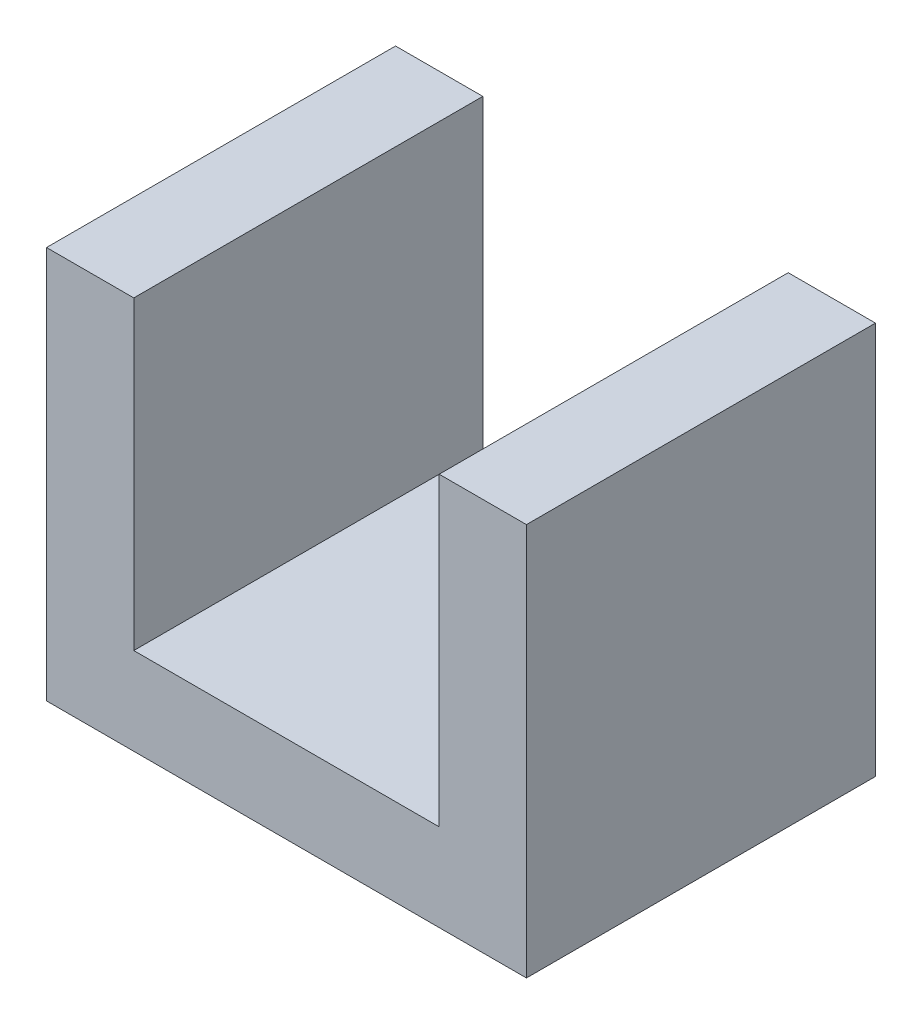
ISO-10303-21;
HEADER;
FILE_DESCRIPTION(('STEP AP214'),'2;1');
FILE_NAME('part.step','',(''),(''),'','','');
FILE_SCHEMA(('AUTOMOTIVE_DESIGN { 1 0 10303 214 1 1 1 1 }'));
ENDSEC;
DATA;
#1=APPLICATION_CONTEXT('core data for automotive mechanical design processes');
#2=APPLICATION_PROTOCOL_DEFINITION('international standard','automotive_design',2000,#1);
#3=PRODUCT_CONTEXT('',#1,'mechanical');
#4=PRODUCT('Part','Part','',(#3));
#5=PRODUCT_RELATED_PRODUCT_CATEGORY('part','',(#4));
#6=PRODUCT_DEFINITION_FORMATION('','',#4);
#7=PRODUCT_DEFINITION_CONTEXT('part definition',#1,'design');
#8=PRODUCT_DEFINITION('design','',#6,#7);
#9=PRODUCT_DEFINITION_SHAPE('','',#8);
#10=(LENGTH_UNIT() NAMED_UNIT(*) SI_UNIT(.MILLI.,.METRE.));
#11=(NAMED_UNIT(*) PLANE_ANGLE_UNIT() SI_UNIT($,.RADIAN.));
#12=(NAMED_UNIT(*) SI_UNIT($,.STERADIAN.) SOLID_ANGLE_UNIT());
#13=UNCERTAINTY_MEASURE_WITH_UNIT(LENGTH_MEASURE(1.E-05),#10,'distance_accuracy_value','');
#14=(GEOMETRIC_REPRESENTATION_CONTEXT(3) GLOBAL_UNCERTAINTY_ASSIGNED_CONTEXT((#13)) GLOBAL_UNIT_ASSIGNED_CONTEXT((#10,
#11,#12)) REPRESENTATION_CONTEXT('',''));
#15=CARTESIAN_POINT('',(0.,0.,0.));
#16=DIRECTION('',(0.,0.,1.));
#17=DIRECTION('',(1.,0.,0.));
#18=AXIS2_PLACEMENT_3D('',#15,#16,#17);
#19=CARTESIAN_POINT('',(-2.,7.,8.));
#20=DIRECTION('',(0.,-1.,0.));
#21=DIRECTION('',(0.,0.,-1.));
#22=AXIS2_PLACEMENT_3D('',#19,#20,#21);
#23=PLANE('',#22);
#24=DIRECTION('',(-1.,0.,0.));
#25=VECTOR('',#24,1.);
#26=CARTESIAN_POINT('',(-2.,7.,0.));
#27=LINE('',#26,#25);
#28=CARTESIAN_POINT('',(0.,7.,0.));
#29=VERTEX_POINT('',#28);
#30=CARTESIAN_POINT('',(-2.,7.,0.));
#31=VERTEX_POINT('',#30);
#32=EDGE_CURVE('E140',#29,#31,#27,.T.);
#33=ORIENTED_EDGE('',*,*,#32,.T.);
#34=DIRECTION('',(0.,0.,-1.));
#35=VECTOR('',#34,1.);
#36=CARTESIAN_POINT('',(-2.,7.,8.));
#37=LINE('',#36,#35);
#38=CARTESIAN_POINT('',(-2.,7.,8.));
#39=VERTEX_POINT('',#38);
#40=EDGE_CURVE('E11',#39,#31,#37,.T.);
#41=ORIENTED_EDGE('',*,*,#40,.F.);
#42=DIRECTION('',(-1.,0.,0.));
#43=VECTOR('',#42,1.);
#44=CARTESIAN_POINT('',(-2.,7.,8.));
#45=LINE('',#44,#43);
#46=CARTESIAN_POINT('',(0.,7.,8.));
#47=VERTEX_POINT('',#46);
#48=EDGE_CURVE('E162',#47,#39,#45,.T.);
#49=ORIENTED_EDGE('',*,*,#48,.F.);
#50=DIRECTION('',(0.,0.,-1.));
#51=VECTOR('',#50,1.);
#52=CARTESIAN_POINT('',(0.,7.,8.));
#53=LINE('',#52,#51);
#54=EDGE_CURVE('E136',#47,#29,#53,.T.);
#55=ORIENTED_EDGE('',*,*,#54,.T.);
#56=EDGE_LOOP('',(#33,#41,#49,#55));
#57=FACE_BOUND('',#56,.T.);
#58=ADVANCED_FACE('F39',(#57),#23,.F.);
#59=CARTESIAN_POINT('',(-2.,-2.,8.));
#60=DIRECTION('',(1.,0.,0.));
#61=DIRECTION('',(0.,0.,-1.));
#62=AXIS2_PLACEMENT_3D('',#59,#60,#61);
#63=PLANE('',#62);
#64=DIRECTION('',(0.,-1.,0.));
#65=VECTOR('',#64,1.);
#66=CARTESIAN_POINT('',(-2.,-2.,0.));
#67=LINE('',#66,#65);
#68=CARTESIAN_POINT('',(-2.,-2.,0.));
#69=VERTEX_POINT('',#68);
#70=EDGE_CURVE('E144',#31,#69,#67,.T.);
#71=ORIENTED_EDGE('',*,*,#70,.T.);
#72=DIRECTION('',(0.,0.,-1.));
#73=VECTOR('',#72,1.);
#74=CARTESIAN_POINT('',(-2.,-2.,8.));
#75=LINE('',#74,#73);
#76=CARTESIAN_POINT('',(-2.,-2.,8.));
#77=VERTEX_POINT('',#76);
#78=EDGE_CURVE('E48',#77,#69,#75,.T.);
#79=ORIENTED_EDGE('',*,*,#78,.F.);
#80=DIRECTION('',(0.,-1.,0.));
#81=VECTOR('',#80,1.);
#82=CARTESIAN_POINT('',(-2.,-2.,8.));
#83=LINE('',#82,#81);
#84=EDGE_CURVE('E99',#39,#77,#83,.T.);
#85=ORIENTED_EDGE('',*,*,#84,.F.);
#86=ORIENTED_EDGE('',*,*,#40,.T.);
#87=EDGE_LOOP('',(#71,#79,#85,#86));
#88=FACE_BOUND('',#87,.T.);
#89=ADVANCED_FACE('F208',(#88),#63,.F.);
#90=CARTESIAN_POINT('',(9.,-2.,8.));
#91=DIRECTION('',(0.,1.,0.));
#92=DIRECTION('',(-1.,0.,0.));
#93=AXIS2_PLACEMENT_3D('',#90,#91,#92);
#94=PLANE('',#93);
#95=DIRECTION('',(1.,0.,0.));
#96=VECTOR('',#95,1.);
#97=CARTESIAN_POINT('',(9.,-2.,0.));
#98=LINE('',#97,#96);
#99=CARTESIAN_POINT('',(9.,-2.,0.));
#100=VERTEX_POINT('',#99);
#101=EDGE_CURVE('E147',#69,#100,#98,.T.);
#102=ORIENTED_EDGE('',*,*,#101,.T.);
#103=DIRECTION('',(0.,0.,-1.));
#104=VECTOR('',#103,1.);
#105=CARTESIAN_POINT('',(9.,-2.,8.));
#106=LINE('',#105,#104);
#107=CARTESIAN_POINT('',(9.,-2.,8.));
#108=VERTEX_POINT('',#107);
#109=EDGE_CURVE('E173',#108,#100,#106,.T.);
#110=ORIENTED_EDGE('',*,*,#109,.F.);
#111=DIRECTION('',(1.,0.,0.));
#112=VECTOR('',#111,1.);
#113=CARTESIAN_POINT('',(9.,-2.,8.));
#114=LINE('',#113,#112);
#115=EDGE_CURVE('E183',#77,#108,#114,.T.);
#116=ORIENTED_EDGE('',*,*,#115,.F.);
#117=ORIENTED_EDGE('',*,*,#78,.T.);
#118=EDGE_LOOP('',(#102,#110,#116,#117));
#119=FACE_BOUND('',#118,.T.);
#120=ADVANCED_FACE('F181',(#119),#94,.F.);
#121=CARTESIAN_POINT('',(9.,7.,8.));
#122=DIRECTION('',(-1.,0.,0.));
#123=DIRECTION('',(0.,-1.,0.));
#124=AXIS2_PLACEMENT_3D('',#121,#122,#123);
#125=PLANE('',#124);
#126=DIRECTION('',(0.,1.,0.));
#127=VECTOR('',#126,1.);
#128=CARTESIAN_POINT('',(9.,7.,0.));
#129=LINE('',#128,#127);
#130=CARTESIAN_POINT('',(9.,7.,0.));
#131=VERTEX_POINT('',#130);
#132=EDGE_CURVE('E150',#100,#131,#129,.T.);
#133=ORIENTED_EDGE('',*,*,#132,.T.);
#134=DIRECTION('',(0.,0.,-1.));
#135=VECTOR('',#134,1.);
#136=CARTESIAN_POINT('',(9.,7.,8.));
#137=LINE('',#136,#135);
#138=CARTESIAN_POINT('',(9.,7.,8.));
#139=VERTEX_POINT('',#138);
#140=EDGE_CURVE('E169',#139,#131,#137,.T.);
#141=ORIENTED_EDGE('',*,*,#140,.F.);
#142=DIRECTION('',(0.,1.,0.));
#143=VECTOR('',#142,1.);
#144=CARTESIAN_POINT('',(9.,7.,8.));
#145=LINE('',#144,#143);
#146=EDGE_CURVE('E196',#108,#139,#145,.T.);
#147=ORIENTED_EDGE('',*,*,#146,.F.);
#148=ORIENTED_EDGE('',*,*,#109,.T.);
#149=EDGE_LOOP('',(#133,#141,#147,#148));
#150=FACE_BOUND('',#149,.T.);
#151=ADVANCED_FACE('F191',(#150),#125,.F.);
#152=CARTESIAN_POINT('',(7.,7.,8.));
#153=DIRECTION('',(0.,-1.,0.));
#154=DIRECTION('',(0.,0.,-1.));
#155=AXIS2_PLACEMENT_3D('',#152,#153,#154);
#156=PLANE('',#155);
#157=DIRECTION('',(-1.,0.,0.));
#158=VECTOR('',#157,1.);
#159=CARTESIAN_POINT('',(7.,7.,0.));
#160=LINE('',#159,#158);
#161=CARTESIAN_POINT('',(7.,7.,0.));
#162=VERTEX_POINT('',#161);
#163=EDGE_CURVE('E153',#131,#162,#160,.T.);
#164=ORIENTED_EDGE('',*,*,#163,.T.);
#165=DIRECTION('',(0.,0.,-1.));
#166=VECTOR('',#165,1.);
#167=CARTESIAN_POINT('',(7.,7.,8.));
#168=LINE('',#167,#166);
#169=CARTESIAN_POINT('',(7.,7.,8.));
#170=VERTEX_POINT('',#169);
#171=EDGE_CURVE('E129',#170,#162,#168,.T.);
#172=ORIENTED_EDGE('',*,*,#171,.F.);
#173=DIRECTION('',(-1.,0.,0.));
#174=VECTOR('',#173,1.);
#175=CARTESIAN_POINT('',(7.,7.,8.));
#176=LINE('',#175,#174);
#177=EDGE_CURVE('E118',#139,#170,#176,.T.);
#178=ORIENTED_EDGE('',*,*,#177,.F.);
#179=ORIENTED_EDGE('',*,*,#140,.T.);
#180=EDGE_LOOP('',(#164,#172,#178,#179));
#181=FACE_BOUND('',#180,.T.);
#182=ADVANCED_FACE('F194',(#181),#156,.F.);
#183=CARTESIAN_POINT('',(7.,0.,8.));
#184=DIRECTION('',(1.,0.,0.));
#185=DIRECTION('',(0.,0.,-1.));
#186=AXIS2_PLACEMENT_3D('',#183,#184,#185);
#187=PLANE('',#186);
#188=DIRECTION('',(0.,-1.,0.));
#189=VECTOR('',#188,1.);
#190=CARTESIAN_POINT('',(7.,0.,0.));
#191=LINE('',#190,#189);
#192=CARTESIAN_POINT('',(7.,0.,0.));
#193=VERTEX_POINT('',#192);
#194=EDGE_CURVE('E127',#162,#193,#191,.T.);
#195=ORIENTED_EDGE('',*,*,#194,.T.);
#196=DIRECTION('',(0.,0.,-1.));
#197=VECTOR('',#196,1.);
#198=CARTESIAN_POINT('',(7.,0.,8.));
#199=LINE('',#198,#197);
#200=CARTESIAN_POINT('',(7.,0.,8.));
#201=VERTEX_POINT('',#200);
#202=EDGE_CURVE('E124',#201,#193,#199,.T.);
#203=ORIENTED_EDGE('',*,*,#202,.F.);
#204=DIRECTION('',(0.,-1.,0.));
#205=VECTOR('',#204,1.);
#206=CARTESIAN_POINT('',(7.,0.,8.));
#207=LINE('',#206,#205);
#208=EDGE_CURVE('E112',#170,#201,#207,.T.);
#209=ORIENTED_EDGE('',*,*,#208,.F.);
#210=ORIENTED_EDGE('',*,*,#171,.T.);
#211=EDGE_LOOP('',(#195,#203,#209,#210));
#212=FACE_BOUND('',#211,.T.);
#213=ADVANCED_FACE('F125',(#212),#187,.F.);
#214=CARTESIAN_POINT('',(0.,0.,8.));
#215=DIRECTION('',(0.,-1.,0.));
#216=DIRECTION('',(0.,0.,-1.));
#217=AXIS2_PLACEMENT_3D('',#214,#215,#216);
#218=PLANE('',#217);
#219=DIRECTION('',(-1.,0.,0.));
#220=VECTOR('',#219,1.);
#221=CARTESIAN_POINT('',(0.,0.,0.));
#222=LINE('',#221,#220);
#223=CARTESIAN_POINT('',(0.,0.,0.));
#224=VERTEX_POINT('',#223);
#225=EDGE_CURVE('E85',#193,#224,#222,.T.);
#226=ORIENTED_EDGE('',*,*,#225,.T.);
#227=DIRECTION('',(0.,0.,-1.));
#228=VECTOR('',#227,1.);
#229=CARTESIAN_POINT('',(0.,0.,8.));
#230=LINE('',#229,#228);
#231=CARTESIAN_POINT('',(0.,0.,8.));
#232=VERTEX_POINT('',#231);
#233=EDGE_CURVE('E130',#232,#224,#230,.T.);
#234=ORIENTED_EDGE('',*,*,#233,.F.);
#235=DIRECTION('',(-1.,0.,0.));
#236=VECTOR('',#235,1.);
#237=CARTESIAN_POINT('',(0.,0.,8.));
#238=LINE('',#237,#236);
#239=EDGE_CURVE('E116',#201,#232,#238,.T.);
#240=ORIENTED_EDGE('',*,*,#239,.F.);
#241=ORIENTED_EDGE('',*,*,#202,.T.);
#242=EDGE_LOOP('',(#226,#234,#240,#241));
#243=FACE_BOUND('',#242,.T.);
#244=ADVANCED_FACE('F132',(#243),#218,.F.);
#245=CARTESIAN_POINT('',(0.,7.,8.));
#246=DIRECTION('',(-1.,0.,0.));
#247=DIRECTION('',(0.,-1.,0.));
#248=AXIS2_PLACEMENT_3D('',#245,#246,#247);
#249=PLANE('',#248);
#250=DIRECTION('',(0.,1.,0.));
#251=VECTOR('',#250,1.);
#252=CARTESIAN_POINT('',(0.,7.,0.));
#253=LINE('',#252,#251);
#254=EDGE_CURVE('E91',#224,#29,#253,.T.);
#255=ORIENTED_EDGE('',*,*,#254,.T.);
#256=ORIENTED_EDGE('',*,*,#54,.F.);
#257=DIRECTION('',(0.,1.,0.));
#258=VECTOR('',#257,1.);
#259=CARTESIAN_POINT('',(0.,7.,8.));
#260=LINE('',#259,#258);
#261=EDGE_CURVE('E56',#232,#47,#260,.T.);
#262=ORIENTED_EDGE('',*,*,#261,.F.);
#263=ORIENTED_EDGE('',*,*,#233,.T.);
#264=EDGE_LOOP('',(#255,#256,#262,#263));
#265=FACE_BOUND('',#264,.T.);
#266=ADVANCED_FACE('F224',(#265),#249,.F.);
#267=CARTESIAN_POINT('',(0.,0.,8.));
#268=DIRECTION('',(0.,0.,-1.));
#269=DIRECTION('',(-1.,0.,0.));
#270=AXIS2_PLACEMENT_3D('',#267,#268,#269);
#271=PLANE('',#270);
#272=ORIENTED_EDGE('',*,*,#48,.T.);
#273=ORIENTED_EDGE('',*,*,#84,.T.);
#274=ORIENTED_EDGE('',*,*,#115,.T.);
#275=ORIENTED_EDGE('',*,*,#146,.T.);
#276=ORIENTED_EDGE('',*,*,#177,.T.);
#277=ORIENTED_EDGE('',*,*,#208,.T.);
#278=ORIENTED_EDGE('',*,*,#239,.T.);
#279=ORIENTED_EDGE('',*,*,#261,.T.);
#280=EDGE_LOOP('',(#272,#273,#274,#275,#276,#277,#278,#279));
#281=FACE_BOUND('',#280,.T.);
#282=ADVANCED_FACE('F114',(#281),#271,.F.);
#283=CARTESIAN_POINT('',(0.,0.,0.));
#284=DIRECTION('',(0.,0.,-1.));
#285=DIRECTION('',(-1.,0.,0.));
#286=AXIS2_PLACEMENT_3D('',#283,#284,#285);
#287=PLANE('',#286);
#288=ORIENTED_EDGE('',*,*,#32,.F.);
#289=ORIENTED_EDGE('',*,*,#254,.F.);
#290=ORIENTED_EDGE('',*,*,#225,.F.);
#291=ORIENTED_EDGE('',*,*,#194,.F.);
#292=ORIENTED_EDGE('',*,*,#163,.F.);
#293=ORIENTED_EDGE('',*,*,#132,.F.);
#294=ORIENTED_EDGE('',*,*,#101,.F.);
#295=ORIENTED_EDGE('',*,*,#70,.F.);
#296=EDGE_LOOP('',(#288,#289,#290,#291,#292,#293,#294,#295));
#297=FACE_BOUND('',#296,.T.);
#298=ADVANCED_FACE('F187',(#297),#287,.T.);
#299=CLOSED_SHELL('',(#58,#89,#120,#151,#182,#213,#244,#266,#282,#298));
#300=MANIFOLD_SOLID_BREP('B2',#299);
#301=ADVANCED_BREP_SHAPE_REPRESENTATION('',(#18,#300),#14);
#302=SHAPE_DEFINITION_REPRESENTATION(#9,#301);
ENDSEC;
END-ISO-10303-21;
